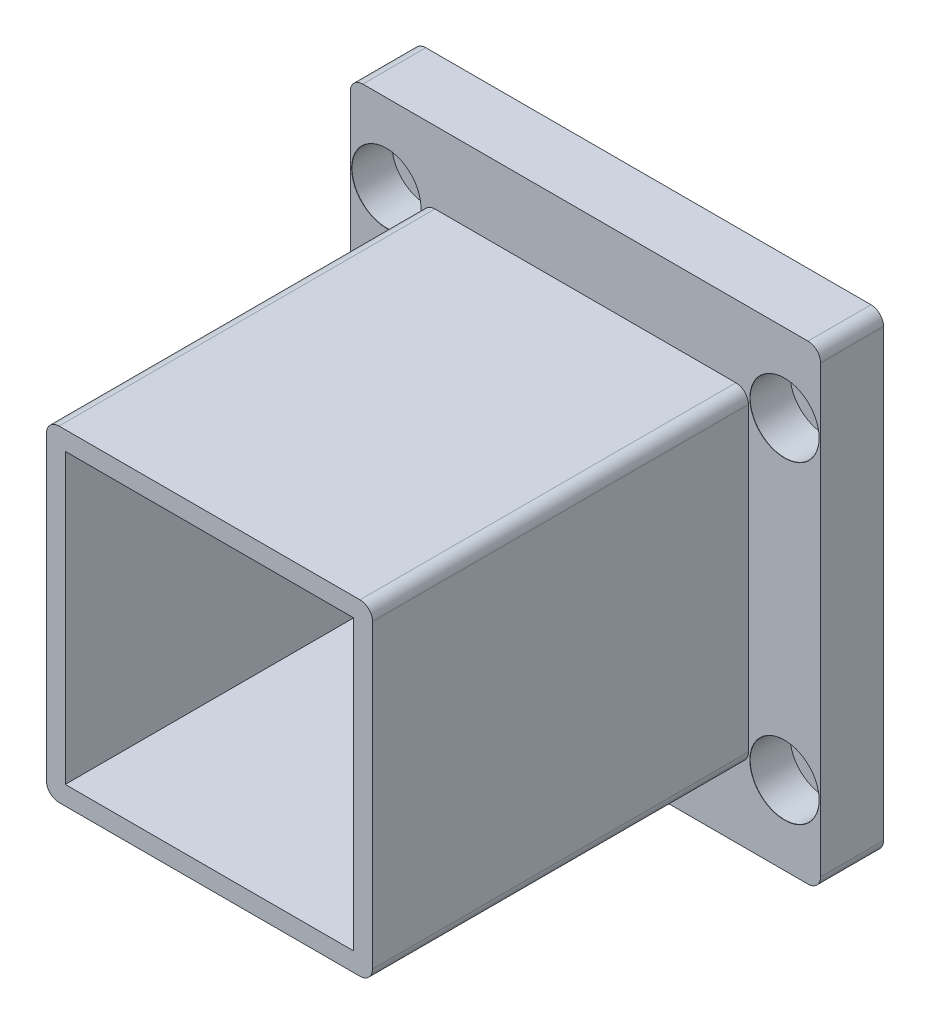
ISO-10303-21;
HEADER;
FILE_DESCRIPTION(('STEP AP214'),'2;1');
FILE_NAME('part.step','',(''),(''),'','','');
FILE_SCHEMA(('AUTOMOTIVE_DESIGN { 1 0 10303 214 1 1 1 1 }'));
ENDSEC;
DATA;
#1=APPLICATION_CONTEXT('core data for automotive mechanical design processes');
#2=APPLICATION_PROTOCOL_DEFINITION('international standard','automotive_design',2000,#1);
#3=PRODUCT_CONTEXT('',#1,'mechanical');
#4=PRODUCT('Part','Part','',(#3));
#5=PRODUCT_RELATED_PRODUCT_CATEGORY('part','',(#4));
#6=PRODUCT_DEFINITION_FORMATION('','',#4);
#7=PRODUCT_DEFINITION_CONTEXT('part definition',#1,'design');
#8=PRODUCT_DEFINITION('design','',#6,#7);
#9=PRODUCT_DEFINITION_SHAPE('','',#8);
#10=(LENGTH_UNIT() NAMED_UNIT(*) SI_UNIT(.MILLI.,.METRE.));
#11=(NAMED_UNIT(*) PLANE_ANGLE_UNIT() SI_UNIT($,.RADIAN.));
#12=(NAMED_UNIT(*) SI_UNIT($,.STERADIAN.) SOLID_ANGLE_UNIT());
#13=UNCERTAINTY_MEASURE_WITH_UNIT(LENGTH_MEASURE(1.E-05),#10,'distance_accuracy_value','');
#14=(GEOMETRIC_REPRESENTATION_CONTEXT(3) GLOBAL_UNCERTAINTY_ASSIGNED_CONTEXT((#13)) GLOBAL_UNIT_ASSIGNED_CONTEXT((#10,
#11,#12)) REPRESENTATION_CONTEXT('',''));
#15=CARTESIAN_POINT('',(0.,0.,0.));
#16=DIRECTION('',(0.,0.,1.));
#17=DIRECTION('',(1.,0.,0.));
#18=AXIS2_PLACEMENT_3D('',#15,#16,#17);
#19=CARTESIAN_POINT('',(0.,-26.0480038732877,65.));
#20=DIRECTION('',(0.,1.,0.));
#21=DIRECTION('',(-1.,0.,0.));
#22=AXIS2_PLACEMENT_3D('',#19,#20,#21);
#23=PLANE('',#22);
#24=DIRECTION('',(1.,0.,0.));
#25=VECTOR('',#24,1.);
#26=CARTESIAN_POINT('',(0.,-26.0480038732877,0.));
#27=LINE('',#26,#25);
#28=CARTESIAN_POINT('',(-27.1460943757474,-26.0480038732877,0.));
#29=VERTEX_POINT('',#28);
#30=CARTESIAN_POINT('',(18.8539056242526,-26.0480038732877,0.));
#31=VERTEX_POINT('',#30);
#32=EDGE_CURVE('E213',#29,#31,#27,.T.);
#33=ORIENTED_EDGE('',*,*,#32,.F.);
#34=DIRECTION('',(0.,0.,-1.));
#35=VECTOR('',#34,1.);
#36=CARTESIAN_POINT('',(-27.1460943757474,-26.0480038732877,65.));
#37=LINE('',#36,#35);
#38=CARTESIAN_POINT('',(-27.1460943757474,-26.0480038732877,65.));
#39=VERTEX_POINT('',#38);
#40=EDGE_CURVE('E223',#39,#29,#37,.T.);
#41=ORIENTED_EDGE('',*,*,#40,.F.);
#42=DIRECTION('',(1.,0.,0.));
#43=VECTOR('',#42,1.);
#44=CARTESIAN_POINT('',(0.,-26.0480038732877,65.));
#45=LINE('',#44,#43);
#46=CARTESIAN_POINT('',(18.8539056242526,-26.0480038732877,65.));
#47=VERTEX_POINT('',#46);
#48=EDGE_CURVE('E402',#39,#47,#45,.T.);
#49=ORIENTED_EDGE('',*,*,#48,.T.);
#50=DIRECTION('',(0.,0.,-1.));
#51=VECTOR('',#50,1.);
#52=CARTESIAN_POINT('',(18.8539056242526,-26.0480038732877,65.));
#53=LINE('',#52,#51);
#54=EDGE_CURVE('E234',#47,#31,#53,.T.);
#55=ORIENTED_EDGE('',*,*,#54,.T.);
#56=EDGE_LOOP('',(#33,#41,#49,#55));
#57=FACE_BOUND('',#56,.T.);
#58=ADVANCED_FACE('F71',(#57),#23,.T.);
#59=CARTESIAN_POINT('',(-27.1460943757474,0.,65.));
#60=DIRECTION('',(-1.,0.,0.));
#61=DIRECTION('',(0.,0.,1.));
#62=AXIS2_PLACEMENT_3D('',#59,#60,#61);
#63=PLANE('',#62);
#64=DIRECTION('',(0.,1.,0.));
#65=VECTOR('',#64,1.);
#66=CARTESIAN_POINT('',(-27.1460943757474,0.,0.));
#67=LINE('',#66,#65);
#68=CARTESIAN_POINT('',(-27.1460943757474,19.9519961267123,0.));
#69=VERTEX_POINT('',#68);
#70=EDGE_CURVE('E209',#29,#69,#67,.T.);
#71=ORIENTED_EDGE('',*,*,#70,.T.);
#72=DIRECTION('',(0.,0.,-1.));
#73=VECTOR('',#72,1.);
#74=CARTESIAN_POINT('',(-27.1460943757474,19.9519961267123,65.));
#75=LINE('',#74,#73);
#76=CARTESIAN_POINT('',(-27.1460943757474,19.9519961267123,65.));
#77=VERTEX_POINT('',#76);
#78=EDGE_CURVE('E232',#77,#69,#75,.T.);
#79=ORIENTED_EDGE('',*,*,#78,.F.);
#80=DIRECTION('',(0.,1.,0.));
#81=VECTOR('',#80,1.);
#82=CARTESIAN_POINT('',(-27.1460943757474,0.,65.));
#83=LINE('',#82,#81);
#84=EDGE_CURVE('E226',#39,#77,#83,.T.);
#85=ORIENTED_EDGE('',*,*,#84,.F.);
#86=ORIENTED_EDGE('',*,*,#40,.T.);
#87=EDGE_LOOP('',(#71,#79,#85,#86));
#88=FACE_BOUND('',#87,.T.);
#89=ADVANCED_FACE('F224',(#88),#63,.F.);
#90=CARTESIAN_POINT('',(0.,19.9519961267123,65.));
#91=DIRECTION('',(0.,1.,0.));
#92=DIRECTION('',(-1.,0.,0.));
#93=AXIS2_PLACEMENT_3D('',#90,#91,#92);
#94=PLANE('',#93);
#95=DIRECTION('',(1.,0.,0.));
#96=VECTOR('',#95,1.);
#97=CARTESIAN_POINT('',(0.,19.9519961267123,0.));
#98=LINE('',#97,#96);
#99=CARTESIAN_POINT('',(18.8539056242526,19.9519961267123,0.));
#100=VERTEX_POINT('',#99);
#101=EDGE_CURVE('E216',#69,#100,#98,.T.);
#102=ORIENTED_EDGE('',*,*,#101,.T.);
#103=DIRECTION('',(0.,0.,-1.));
#104=VECTOR('',#103,1.);
#105=CARTESIAN_POINT('',(18.8539056242526,19.9519961267123,65.));
#106=LINE('',#105,#104);
#107=CARTESIAN_POINT('',(18.8539056242526,19.9519961267123,65.));
#108=VERTEX_POINT('',#107);
#109=EDGE_CURVE('E255',#108,#100,#106,.T.);
#110=ORIENTED_EDGE('',*,*,#109,.F.);
#111=DIRECTION('',(1.,0.,0.));
#112=VECTOR('',#111,1.);
#113=CARTESIAN_POINT('',(0.,19.9519961267123,65.));
#114=LINE('',#113,#112);
#115=EDGE_CURVE('E406',#77,#108,#114,.T.);
#116=ORIENTED_EDGE('',*,*,#115,.F.);
#117=ORIENTED_EDGE('',*,*,#78,.T.);
#118=EDGE_LOOP('',(#102,#110,#116,#117));
#119=FACE_BOUND('',#118,.T.);
#120=ADVANCED_FACE('F415',(#119),#94,.F.);
#121=CARTESIAN_POINT('',(0.,22.9519961267123,65.));
#122=DIRECTION('',(0.,1.,0.));
#123=DIRECTION('',(-1.,0.,0.));
#124=AXIS2_PLACEMENT_3D('',#121,#122,#123);
#125=PLANE('',#124);
#126=DIRECTION('',(-1.,0.,0.));
#127=VECTOR('',#126,1.);
#128=CARTESIAN_POINT('',(-30.1460943757474,22.9519961267123,5.04707913219928));
#129=LINE('',#128,#127);
#130=CARTESIAN_POINT('',(19.8539056242526,22.9519961267123,5.04707913219928));
#131=VERTEX_POINT('',#130);
#132=CARTESIAN_POINT('',(-28.1460943757474,22.9519961267123,5.04707913219928));
#133=VERTEX_POINT('',#132);
#134=EDGE_CURVE('E362',#131,#133,#129,.T.);
#135=ORIENTED_EDGE('',*,*,#134,.T.);
#136=DIRECTION('',(0.,0.,-1.));
#137=VECTOR('',#136,1.);
#138=CARTESIAN_POINT('',(-28.1460943757474,22.9519961267123,65.));
#139=LINE('',#138,#137);
#140=CARTESIAN_POINT('',(-28.1460943757474,22.9519961267123,65.));
#141=VERTEX_POINT('',#140);
#142=EDGE_CURVE('E297',#133,#141,#139,.F.);
#143=ORIENTED_EDGE('',*,*,#142,.T.);
#144=DIRECTION('',(1.,0.,0.));
#145=VECTOR('',#144,1.);
#146=CARTESIAN_POINT('',(0.,22.9519961267123,65.));
#147=LINE('',#146,#145);
#148=CARTESIAN_POINT('',(19.8539056242526,22.9519961267123,65.));
#149=VERTEX_POINT('',#148);
#150=EDGE_CURVE('E252',#141,#149,#147,.T.);
#151=ORIENTED_EDGE('',*,*,#150,.T.);
#152=DIRECTION('',(0.,0.,-1.));
#153=VECTOR('',#152,1.);
#154=CARTESIAN_POINT('',(19.8539056242526,22.9519961267123,5.04707913219928));
#155=LINE('',#154,#153);
#156=EDGE_CURVE('E293',#149,#131,#155,.T.);
#157=ORIENTED_EDGE('',*,*,#156,.T.);
#158=EDGE_LOOP('',(#135,#143,#151,#157));
#159=FACE_BOUND('',#158,.T.);
#160=ADVANCED_FACE('F369',(#159),#125,.T.);
#161=CARTESIAN_POINT('',(-30.1460943757474,0.,65.));
#162=DIRECTION('',(-1.,0.,0.));
#163=DIRECTION('',(0.,0.,1.));
#164=AXIS2_PLACEMENT_3D('',#161,#162,#163);
#165=PLANE('',#164);
#166=DIRECTION('',(0.,-1.,0.));
#167=VECTOR('',#166,1.);
#168=CARTESIAN_POINT('',(-30.1460943757474,22.9519961267123,5.04707913219928));
#169=LINE('',#168,#167);
#170=CARTESIAN_POINT('',(-30.1460943757474,20.9519961267123,5.04707913219928));
#171=VERTEX_POINT('',#170);
#172=CARTESIAN_POINT('',(-30.1460943757474,-27.0480038732877,5.04707913219928));
#173=VERTEX_POINT('',#172);
#174=EDGE_CURVE('E364',#171,#173,#169,.T.);
#175=ORIENTED_EDGE('',*,*,#174,.T.);
#176=DIRECTION('',(0.,0.,-1.));
#177=VECTOR('',#176,1.);
#178=CARTESIAN_POINT('',(-30.1460943757474,-27.0480038732877,65.));
#179=LINE('',#178,#177);
#180=CARTESIAN_POINT('',(-30.1460943757474,-27.0480038732877,65.));
#181=VERTEX_POINT('',#180);
#182=EDGE_CURVE('E290',#173,#181,#179,.F.);
#183=ORIENTED_EDGE('',*,*,#182,.T.);
#184=DIRECTION('',(0.,1.,0.));
#185=VECTOR('',#184,1.);
#186=CARTESIAN_POINT('',(-30.1460943757474,0.,65.));
#187=LINE('',#186,#185);
#188=CARTESIAN_POINT('',(-30.1460943757474,20.9519961267123,65.));
#189=VERTEX_POINT('',#188);
#190=EDGE_CURVE('E385',#181,#189,#187,.T.);
#191=ORIENTED_EDGE('',*,*,#190,.T.);
#192=DIRECTION('',(0.,0.,-1.));
#193=VECTOR('',#192,1.);
#194=CARTESIAN_POINT('',(-30.1460943757474,20.9519961267123,65.));
#195=LINE('',#194,#193);
#196=EDGE_CURVE('E286',#189,#171,#195,.T.);
#197=ORIENTED_EDGE('',*,*,#196,.T.);
#198=EDGE_LOOP('',(#175,#183,#191,#197));
#199=FACE_BOUND('',#198,.T.);
#200=ADVANCED_FACE('F388',(#199),#165,.T.);
#201=CARTESIAN_POINT('',(0.,-29.0480038732877,65.));
#202=DIRECTION('',(0.,1.,0.));
#203=DIRECTION('',(-1.,0.,0.));
#204=AXIS2_PLACEMENT_3D('',#201,#202,#203);
#205=PLANE('',#204);
#206=DIRECTION('',(1.,0.,0.));
#207=VECTOR('',#206,1.);
#208=CARTESIAN_POINT('',(-30.1460943757474,-29.0480038732877,5.04707913219928));
#209=LINE('',#208,#207);
#210=CARTESIAN_POINT('',(-28.1460943757474,-29.0480038732877,5.04707913219928));
#211=VERTEX_POINT('',#210);
#212=CARTESIAN_POINT('',(19.8539056242526,-29.0480038732877,5.04707913219928));
#213=VERTEX_POINT('',#212);
#214=EDGE_CURVE('E835',#211,#213,#209,.T.);
#215=ORIENTED_EDGE('',*,*,#214,.T.);
#216=DIRECTION('',(0.,0.,-1.));
#217=VECTOR('',#216,1.);
#218=CARTESIAN_POINT('',(19.8539056242526,-29.0480038732877,65.));
#219=LINE('',#218,#217);
#220=CARTESIAN_POINT('',(19.8539056242526,-29.0480038732877,65.));
#221=VERTEX_POINT('',#220);
#222=EDGE_CURVE('E271',#213,#221,#219,.F.);
#223=ORIENTED_EDGE('',*,*,#222,.T.);
#224=DIRECTION('',(1.,0.,0.));
#225=VECTOR('',#224,1.);
#226=CARTESIAN_POINT('',(0.,-29.0480038732877,65.));
#227=LINE('',#226,#225);
#228=CARTESIAN_POINT('',(-28.1460943757474,-29.0480038732877,65.));
#229=VERTEX_POINT('',#228);
#230=EDGE_CURVE('E391',#229,#221,#227,.T.);
#231=ORIENTED_EDGE('',*,*,#230,.F.);
#232=DIRECTION('',(0.,0.,-1.));
#233=VECTOR('',#232,1.);
#234=CARTESIAN_POINT('',(-28.1460943757474,-29.0480038732877,5.04707913219928));
#235=LINE('',#234,#233);
#236=EDGE_CURVE('E267',#229,#211,#235,.T.);
#237=ORIENTED_EDGE('',*,*,#236,.T.);
#238=EDGE_LOOP('',(#215,#223,#231,#237));
#239=FACE_BOUND('',#238,.T.);
#240=ADVANCED_FACE('F434',(#239),#205,.F.);
#241=CARTESIAN_POINT('',(21.8539056242526,0.,65.));
#242=DIRECTION('',(-1.,0.,0.));
#243=DIRECTION('',(0.,0.,1.));
#244=AXIS2_PLACEMENT_3D('',#241,#242,#243);
#245=PLANE('',#244);
#246=DIRECTION('',(0.,1.,0.));
#247=VECTOR('',#246,1.);
#248=CARTESIAN_POINT('',(21.8539056242526,0.,65.));
#249=LINE('',#248,#247);
#250=CARTESIAN_POINT('',(21.8539056242526,-27.0480038732877,65.));
#251=VERTEX_POINT('',#250);
#252=CARTESIAN_POINT('',(21.8539056242526,20.9519961267123,65.));
#253=VERTEX_POINT('',#252);
#254=EDGE_CURVE('E395',#251,#253,#249,.T.);
#255=ORIENTED_EDGE('',*,*,#254,.F.);
#256=DIRECTION('',(0.,0.,-1.));
#257=VECTOR('',#256,1.);
#258=CARTESIAN_POINT('',(21.8539056242526,-27.0480038732877,65.));
#259=LINE('',#258,#257);
#260=CARTESIAN_POINT('',(21.8539056242526,-27.0480038732877,5.04707913219928));
#261=VERTEX_POINT('',#260);
#262=EDGE_CURVE('E263',#251,#261,#259,.T.);
#263=ORIENTED_EDGE('',*,*,#262,.T.);
#264=DIRECTION('',(0.,1.,0.));
#265=VECTOR('',#264,1.);
#266=CARTESIAN_POINT('',(21.8539056242526,22.9519961267123,5.04707913219928));
#267=LINE('',#266,#265);
#268=CARTESIAN_POINT('',(21.8539056242526,20.9519961267123,5.04707913219928));
#269=VERTEX_POINT('',#268);
#270=EDGE_CURVE('E375',#261,#269,#267,.T.);
#271=ORIENTED_EDGE('',*,*,#270,.T.);
#272=DIRECTION('',(0.,0.,-1.));
#273=VECTOR('',#272,1.);
#274=CARTESIAN_POINT('',(21.8539056242526,20.9519961267123,65.));
#275=LINE('',#274,#273);
#276=EDGE_CURVE('E231',#269,#253,#275,.F.);
#277=ORIENTED_EDGE('',*,*,#276,.T.);
#278=EDGE_LOOP('',(#255,#263,#271,#277));
#279=FACE_BOUND('',#278,.T.);
#280=ADVANCED_FACE('F431',(#279),#245,.F.);
#281=CARTESIAN_POINT('',(18.8539056242526,0.,65.));
#282=DIRECTION('',(-1.,0.,0.));
#283=DIRECTION('',(0.,0.,1.));
#284=AXIS2_PLACEMENT_3D('',#281,#282,#283);
#285=PLANE('',#284);
#286=DIRECTION('',(0.,1.,0.));
#287=VECTOR('',#286,1.);
#288=CARTESIAN_POINT('',(18.8539056242526,0.,0.));
#289=LINE('',#288,#287);
#290=EDGE_CURVE('E249',#31,#100,#289,.T.);
#291=ORIENTED_EDGE('',*,*,#290,.F.);
#292=ORIENTED_EDGE('',*,*,#54,.F.);
#293=DIRECTION('',(0.,1.,0.));
#294=VECTOR('',#293,1.);
#295=CARTESIAN_POINT('',(18.8539056242526,0.,65.));
#296=LINE('',#295,#294);
#297=EDGE_CURVE('E244',#47,#108,#296,.T.);
#298=ORIENTED_EDGE('',*,*,#297,.T.);
#299=ORIENTED_EDGE('',*,*,#109,.T.);
#300=EDGE_LOOP('',(#291,#292,#298,#299));
#301=FACE_BOUND('',#300,.T.);
#302=ADVANCED_FACE('F413',(#301),#285,.T.);
#303=CARTESIAN_POINT('',(0.,0.,65.));
#304=DIRECTION('',(0.,0.,1.));
#305=DIRECTION('',(1.,0.,0.));
#306=AXIS2_PLACEMENT_3D('',#303,#304,#305);
#307=PLANE('',#306);
#308=ORIENTED_EDGE('',*,*,#230,.T.);
#309=CARTESIAN_POINT('',(19.8539056242526,-27.0480038732877,65.));
#310=DIRECTION('',(0.,0.,1.));
#311=DIRECTION('',(1.,0.,0.));
#312=AXIS2_PLACEMENT_3D('',#309,#310,#311);
#313=CIRCLE('',#312,2.);
#314=EDGE_CURVE('E283',#221,#251,#313,.T.);
#315=ORIENTED_EDGE('',*,*,#314,.T.);
#316=ORIENTED_EDGE('',*,*,#254,.T.);
#317=CARTESIAN_POINT('',(19.8539056242526,20.9519961267123,65.));
#318=DIRECTION('',(0.,0.,1.));
#319=DIRECTION('',(1.,0.,0.));
#320=AXIS2_PLACEMENT_3D('',#317,#318,#319);
#321=CIRCLE('',#320,2.);
#322=EDGE_CURVE('E274',#253,#149,#321,.T.);
#323=ORIENTED_EDGE('',*,*,#322,.T.);
#324=ORIENTED_EDGE('',*,*,#150,.F.);
#325=CARTESIAN_POINT('',(-28.1460943757474,20.9519961267123,65.));
#326=DIRECTION('',(0.,0.,1.));
#327=DIRECTION('',(1.,0.,0.));
#328=AXIS2_PLACEMENT_3D('',#325,#326,#327);
#329=CIRCLE('',#328,2.);
#330=EDGE_CURVE('E277',#141,#189,#329,.T.);
#331=ORIENTED_EDGE('',*,*,#330,.T.);
#332=ORIENTED_EDGE('',*,*,#190,.F.);
#333=CARTESIAN_POINT('',(-28.1460943757474,-27.0480038732877,65.));
#334=DIRECTION('',(0.,0.,1.));
#335=DIRECTION('',(1.,0.,0.));
#336=AXIS2_PLACEMENT_3D('',#333,#334,#335);
#337=CIRCLE('',#336,2.);
#338=EDGE_CURVE('E280',#181,#229,#337,.T.);
#339=ORIENTED_EDGE('',*,*,#338,.T.);
#340=EDGE_LOOP('',(#308,#315,#316,#323,#324,#331,#332,#339));
#341=FACE_BOUND('',#340,.T.);
#342=ORIENTED_EDGE('',*,*,#48,.F.);
#343=ORIENTED_EDGE('',*,*,#84,.T.);
#344=ORIENTED_EDGE('',*,*,#115,.T.);
#345=ORIENTED_EDGE('',*,*,#297,.F.);
#346=EDGE_LOOP('',(#342,#343,#344,#345));
#347=FACE_BOUND('',#346,.T.);
#348=ADVANCED_FACE('F383',(#341,#347),#307,.T.);
#349=CARTESIAN_POINT('',(0.,0.,0.));
#350=DIRECTION('',(0.,0.,-1.));
#351=DIRECTION('',(-1.,0.,0.));
#352=AXIS2_PLACEMENT_3D('',#349,#350,#351);
#353=PLANE('',#352);
#354=ORIENTED_EDGE('',*,*,#70,.F.);
#355=ORIENTED_EDGE('',*,*,#32,.T.);
#356=ORIENTED_EDGE('',*,*,#290,.T.);
#357=ORIENTED_EDGE('',*,*,#101,.F.);
#358=EDGE_LOOP('',(#354,#355,#356,#357));
#359=FACE_BOUND('',#358,.T.);
#360=ADVANCED_FACE('F211',(#359),#353,.F.);
#361=CARTESIAN_POINT('',(0.,0.,5.04707913219928));
#362=DIRECTION('',(0.,0.,1.));
#363=DIRECTION('',(1.,0.,0.));
#364=AXIS2_PLACEMENT_3D('',#361,#362,#363);
#365=PLANE('',#364);
#366=CARTESIAN_POINT('',(-35.8960943757474,21.9519961267123,5.04707913219928));
#367=DIRECTION('',(0.,0.,1.));
#368=DIRECTION('',(1.,0.,0.));
#369=AXIS2_PLACEMENT_3D('',#366,#367,#368);
#370=CIRCLE('',#369,5.525);
#371=CARTESIAN_POINT('',(-30.3710943757474,21.9519961267123,5.04707913219928));
#372=VERTEX_POINT('',#371);
#373=EDGE_CURVE('E916',#372,#372,#370,.T.);
#374=ORIENTED_EDGE('',*,*,#373,.F.);
#375=EDGE_LOOP('',(#374));
#376=FACE_BOUND('',#375,.T.);
#377=CARTESIAN_POINT('',(-35.8960943757474,-28.0480038732877,5.04707913219928));
#378=DIRECTION('',(0.,0.,1.));
#379=DIRECTION('',(1.,0.,0.));
#380=AXIS2_PLACEMENT_3D('',#377,#378,#379);
#381=CIRCLE('',#380,5.525);
#382=CARTESIAN_POINT('',(-30.3710943757474,-28.0480038732877,5.04707913219928));
#383=VERTEX_POINT('',#382);
#384=EDGE_CURVE('E898',#383,#383,#381,.T.);
#385=ORIENTED_EDGE('',*,*,#384,.F.);
#386=EDGE_LOOP('',(#385));
#387=FACE_BOUND('',#386,.T.);
#388=CARTESIAN_POINT('',(27.6039056242526,21.9519961267123,5.04707913219928));
#389=DIRECTION('',(0.,0.,1.));
#390=DIRECTION('',(1.,0.,0.));
#391=AXIS2_PLACEMENT_3D('',#388,#389,#390);
#392=CIRCLE('',#391,5.52500000000001);
#393=CARTESIAN_POINT('',(33.1289056242526,21.9519961267123,5.04707913219928));
#394=VERTEX_POINT('',#393);
#395=EDGE_CURVE('E880',#394,#394,#392,.T.);
#396=ORIENTED_EDGE('',*,*,#395,.F.);
#397=EDGE_LOOP('',(#396));
#398=FACE_BOUND('',#397,.T.);
#399=CARTESIAN_POINT('',(27.6039056242526,-28.0480038732877,5.04707913219928));
#400=DIRECTION('',(0.,0.,1.));
#401=DIRECTION('',(1.,0.,0.));
#402=AXIS2_PLACEMENT_3D('',#399,#400,#401);
#403=CIRCLE('',#402,5.525);
#404=CARTESIAN_POINT('',(33.1289056242526,-28.0480038732877,5.04707913219928));
#405=VERTEX_POINT('',#404);
#406=EDGE_CURVE('E862',#405,#405,#403,.T.);
#407=ORIENTED_EDGE('',*,*,#406,.F.);
#408=EDGE_LOOP('',(#407));
#409=FACE_BOUND('',#408,.T.);
#410=DIRECTION('',(0.,1.,0.));
#411=VECTOR('',#410,1.);
#412=CARTESIAN_POINT('',(33.3539056242526,34.4519961267123,5.04707913219928));
#413=LINE('',#412,#411);
#414=CARTESIAN_POINT('',(33.3539056242526,-38.5480038732877,5.04707913219928));
#415=VERTEX_POINT('',#414);
#416=CARTESIAN_POINT('',(33.3539056242526,32.4519961267123,5.04707913219928));
#417=VERTEX_POINT('',#416);
#418=EDGE_CURVE('E483',#415,#417,#413,.T.);
#419=ORIENTED_EDGE('',*,*,#418,.T.);
#420=CARTESIAN_POINT('',(31.3539056242526,32.4519961267123,5.04707913219928));
#421=DIRECTION('',(0.,0.,1.));
#422=DIRECTION('',(1.,0.,0.));
#423=AXIS2_PLACEMENT_3D('',#420,#421,#422);
#424=CIRCLE('',#423,2.);
#425=CARTESIAN_POINT('',(31.3539056242526,34.4519961267123,5.04707913219928));
#426=VERTEX_POINT('',#425);
#427=EDGE_CURVE('E316',#417,#426,#424,.T.);
#428=ORIENTED_EDGE('',*,*,#427,.T.);
#429=DIRECTION('',(-1.,0.,0.));
#430=VECTOR('',#429,1.);
#431=CARTESIAN_POINT('',(-41.6460943757474,34.4519961267123,5.04707913219928));
#432=LINE('',#431,#430);
#433=CARTESIAN_POINT('',(-39.6460943757474,34.4519961267123,5.04707913219928));
#434=VERTEX_POINT('',#433);
#435=EDGE_CURVE('E489',#426,#434,#432,.T.);
#436=ORIENTED_EDGE('',*,*,#435,.T.);
#437=CARTESIAN_POINT('',(-39.6460943757474,32.4519961267123,5.04707913219928));
#438=DIRECTION('',(0.,0.,1.));
#439=DIRECTION('',(1.,0.,0.));
#440=AXIS2_PLACEMENT_3D('',#437,#438,#439);
#441=CIRCLE('',#440,2.);
#442=CARTESIAN_POINT('',(-41.6460943757474,32.4519961267123,5.04707913219928));
#443=VERTEX_POINT('',#442);
#444=EDGE_CURVE('E313',#434,#443,#441,.T.);
#445=ORIENTED_EDGE('',*,*,#444,.T.);
#446=DIRECTION('',(0.,-1.,0.));
#447=VECTOR('',#446,1.);
#448=CARTESIAN_POINT('',(-41.6460943757474,34.4519961267123,5.04707913219928));
#449=LINE('',#448,#447);
#450=CARTESIAN_POINT('',(-41.6460943757473,-38.5480038732877,5.04707913219928));
#451=VERTEX_POINT('',#450);
#452=EDGE_CURVE('E374',#443,#451,#449,.T.);
#453=ORIENTED_EDGE('',*,*,#452,.T.);
#454=CARTESIAN_POINT('',(-39.6460943757474,-38.5480038732877,5.04707913219928));
#455=DIRECTION('',(0.,0.,1.));
#456=DIRECTION('',(1.,0.,0.));
#457=AXIS2_PLACEMENT_3D('',#454,#455,#456);
#458=CIRCLE('',#457,2.);
#459=CARTESIAN_POINT('',(-39.6460943757474,-40.5480038732877,5.04707913219928));
#460=VERTEX_POINT('',#459);
#461=EDGE_CURVE('E310',#451,#460,#458,.T.);
#462=ORIENTED_EDGE('',*,*,#461,.T.);
#463=DIRECTION('',(1.,0.,0.));
#464=VECTOR('',#463,1.);
#465=CARTESIAN_POINT('',(-41.6460943757473,-40.5480038732877,5.04707913219928));
#466=LINE('',#465,#464);
#467=CARTESIAN_POINT('',(31.3539056242526,-40.5480038732877,5.04707913219928));
#468=VERTEX_POINT('',#467);
#469=EDGE_CURVE('E480',#460,#468,#466,.T.);
#470=ORIENTED_EDGE('',*,*,#469,.T.);
#471=CARTESIAN_POINT('',(31.3539056242526,-38.5480038732877,5.04707913219928));
#472=DIRECTION('',(0.,0.,1.));
#473=DIRECTION('',(1.,0.,0.));
#474=AXIS2_PLACEMENT_3D('',#471,#472,#473);
#475=CIRCLE('',#474,2.);
#476=EDGE_CURVE('E307',#468,#415,#475,.T.);
#477=ORIENTED_EDGE('',*,*,#476,.T.);
#478=EDGE_LOOP('',(#419,#428,#436,#445,#453,#462,#470,#477));
#479=FACE_BOUND('',#478,.T.);
#480=ORIENTED_EDGE('',*,*,#214,.F.);
#481=CARTESIAN_POINT('',(-28.1460943757474,-27.0480038732877,5.04707913219928));
#482=DIRECTION('',(0.,0.,1.));
#483=DIRECTION('',(1.,0.,0.));
#484=AXIS2_PLACEMENT_3D('',#481,#482,#483);
#485=CIRCLE('',#484,2.);
#486=EDGE_CURVE('E353',#211,#173,#485,.F.);
#487=ORIENTED_EDGE('',*,*,#486,.T.);
#488=ORIENTED_EDGE('',*,*,#174,.F.);
#489=CARTESIAN_POINT('',(-28.1460943757474,20.9519961267123,5.04707913219928));
#490=DIRECTION('',(0.,0.,1.));
#491=DIRECTION('',(1.,0.,0.));
#492=AXIS2_PLACEMENT_3D('',#489,#490,#491);
#493=CIRCLE('',#492,2.);
#494=EDGE_CURVE('E80',#171,#133,#493,.F.);
#495=ORIENTED_EDGE('',*,*,#494,.T.);
#496=ORIENTED_EDGE('',*,*,#134,.F.);
#497=CARTESIAN_POINT('',(19.8539056242526,20.9519961267123,5.04707913219928));
#498=DIRECTION('',(0.,0.,1.));
#499=DIRECTION('',(1.,0.,0.));
#500=AXIS2_PLACEMENT_3D('',#497,#498,#499);
#501=CIRCLE('',#500,2.);
#502=EDGE_CURVE('E12',#131,#269,#501,.F.);
#503=ORIENTED_EDGE('',*,*,#502,.T.);
#504=ORIENTED_EDGE('',*,*,#270,.F.);
#505=CARTESIAN_POINT('',(19.8539056242526,-27.0480038732877,5.04707913219928));
#506=DIRECTION('',(0.,0.,1.));
#507=DIRECTION('',(1.,0.,0.));
#508=AXIS2_PLACEMENT_3D('',#505,#506,#507);
#509=CIRCLE('',#508,2.);
#510=EDGE_CURVE('E350',#261,#213,#509,.F.);
#511=ORIENTED_EDGE('',*,*,#510,.T.);
#512=EDGE_LOOP('',(#480,#487,#488,#495,#496,#503,#504,#511));
#513=FACE_BOUND('',#512,.T.);
#514=ADVANCED_FACE('F361',(#376,#387,#398,#409,#479,#513),#365,.T.);
#515=CARTESIAN_POINT('',(0.,0.,-5.));
#516=DIRECTION('',(0.,0.,-1.));
#517=DIRECTION('',(-1.,0.,0.));
#518=AXIS2_PLACEMENT_3D('',#515,#516,#517);
#519=PLANE('',#518);
#520=CARTESIAN_POINT('',(-35.8960943757474,21.9519961267123,-5.));
#521=DIRECTION('',(0.,0.,1.));
#522=DIRECTION('',(1.,0.,0.));
#523=AXIS2_PLACEMENT_3D('',#520,#521,#522);
#524=CIRCLE('',#523,3.3);
#525=CARTESIAN_POINT('',(-32.5960943757474,21.9519961267123,-5.));
#526=VERTEX_POINT('',#525);
#527=EDGE_CURVE('E818',#526,#526,#524,.T.);
#528=ORIENTED_EDGE('',*,*,#527,.T.);
#529=EDGE_LOOP('',(#528));
#530=FACE_BOUND('',#529,.T.);
#531=CARTESIAN_POINT('',(-35.8960943757474,-28.0480038732877,-5.));
#532=DIRECTION('',(0.,0.,1.));
#533=DIRECTION('',(1.,0.,0.));
#534=AXIS2_PLACEMENT_3D('',#531,#532,#533);
#535=CIRCLE('',#534,3.3);
#536=CARTESIAN_POINT('',(-32.5960943757474,-28.0480038732877,-5.));
#537=VERTEX_POINT('',#536);
#538=EDGE_CURVE('E822',#537,#537,#535,.T.);
#539=ORIENTED_EDGE('',*,*,#538,.T.);
#540=EDGE_LOOP('',(#539));
#541=FACE_BOUND('',#540,.T.);
#542=CARTESIAN_POINT('',(27.6039056242526,21.9519961267123,-5.));
#543=DIRECTION('',(0.,0.,1.));
#544=DIRECTION('',(1.,0.,0.));
#545=AXIS2_PLACEMENT_3D('',#542,#543,#544);
#546=CIRCLE('',#545,3.3);
#547=CARTESIAN_POINT('',(30.9039056242526,21.9519961267123,-5.));
#548=VERTEX_POINT('',#547);
#549=EDGE_CURVE('E826',#548,#548,#546,.T.);
#550=ORIENTED_EDGE('',*,*,#549,.T.);
#551=EDGE_LOOP('',(#550));
#552=FACE_BOUND('',#551,.T.);
#553=CARTESIAN_POINT('',(27.6039056242526,-28.0480038732877,-5.));
#554=DIRECTION('',(0.,0.,1.));
#555=DIRECTION('',(1.,0.,0.));
#556=AXIS2_PLACEMENT_3D('',#553,#554,#555);
#557=CIRCLE('',#556,3.3);
#558=CARTESIAN_POINT('',(30.9039056242526,-28.0480038732877,-5.));
#559=VERTEX_POINT('',#558);
#560=EDGE_CURVE('E829',#559,#559,#557,.T.);
#561=ORIENTED_EDGE('',*,*,#560,.T.);
#562=EDGE_LOOP('',(#561));
#563=FACE_BOUND('',#562,.T.);
#564=DIRECTION('',(1.,0.,0.));
#565=VECTOR('',#564,1.);
#566=CARTESIAN_POINT('',(0.,34.4519961267123,-5.));
#567=LINE('',#566,#565);
#568=CARTESIAN_POINT('',(-39.6460943757474,34.4519961267123,-5.));
#569=VERTEX_POINT('',#568);
#570=CARTESIAN_POINT('',(31.3539056242526,34.4519961267123,-5.));
#571=VERTEX_POINT('',#570);
#572=EDGE_CURVE('E237',#569,#571,#567,.T.);
#573=ORIENTED_EDGE('',*,*,#572,.T.);
#574=CARTESIAN_POINT('',(31.3539056242526,32.4519961267123,-5.));
#575=DIRECTION('',(0.,0.,-1.));
#576=DIRECTION('',(-1.,0.,0.));
#577=AXIS2_PLACEMENT_3D('',#574,#575,#576);
#578=CIRCLE('',#577,2.);
#579=CARTESIAN_POINT('',(33.3539056242526,32.4519961267123,-5.));
#580=VERTEX_POINT('',#579);
#581=EDGE_CURVE('E334',#571,#580,#578,.T.);
#582=ORIENTED_EDGE('',*,*,#581,.T.);
#583=DIRECTION('',(0.,1.,0.));
#584=VECTOR('',#583,1.);
#585=CARTESIAN_POINT('',(33.3539056242526,0.,-5.));
#586=LINE('',#585,#584);
#587=CARTESIAN_POINT('',(33.3539056242526,-38.5480038732877,-5.));
#588=VERTEX_POINT('',#587);
#589=EDGE_CURVE('E492',#588,#580,#586,.T.);
#590=ORIENTED_EDGE('',*,*,#589,.F.);
#591=CARTESIAN_POINT('',(31.3539056242526,-38.5480038732877,-5.));
#592=DIRECTION('',(0.,0.,-1.));
#593=DIRECTION('',(-1.,0.,0.));
#594=AXIS2_PLACEMENT_3D('',#591,#592,#593);
#595=CIRCLE('',#594,2.);
#596=CARTESIAN_POINT('',(31.3539056242526,-40.5480038732877,-5.));
#597=VERTEX_POINT('',#596);
#598=EDGE_CURVE('E326',#588,#597,#595,.T.);
#599=ORIENTED_EDGE('',*,*,#598,.T.);
#600=DIRECTION('',(1.,0.,0.));
#601=VECTOR('',#600,1.);
#602=CARTESIAN_POINT('',(0.,-40.5480038732877,-5.));
#603=LINE('',#602,#601);
#604=CARTESIAN_POINT('',(-39.6460943757474,-40.5480038732877,-5.));
#605=VERTEX_POINT('',#604);
#606=EDGE_CURVE('E496',#605,#597,#603,.T.);
#607=ORIENTED_EDGE('',*,*,#606,.F.);
#608=CARTESIAN_POINT('',(-39.6460943757474,-38.5480038732877,-5.));
#609=DIRECTION('',(0.,0.,-1.));
#610=DIRECTION('',(-1.,0.,0.));
#611=AXIS2_PLACEMENT_3D('',#608,#609,#610);
#612=CIRCLE('',#611,2.);
#613=CARTESIAN_POINT('',(-41.6460943757474,-38.5480038732877,-5.));
#614=VERTEX_POINT('',#613);
#615=EDGE_CURVE('E94',#605,#614,#612,.T.);
#616=ORIENTED_EDGE('',*,*,#615,.T.);
#617=DIRECTION('',(0.,1.,0.));
#618=VECTOR('',#617,1.);
#619=CARTESIAN_POINT('',(-41.6460943757474,0.,-5.));
#620=LINE('',#619,#618);
#621=CARTESIAN_POINT('',(-41.6460943757474,32.4519961267123,-5.));
#622=VERTEX_POINT('',#621);
#623=EDGE_CURVE('E241',#614,#622,#620,.T.);
#624=ORIENTED_EDGE('',*,*,#623,.T.);
#625=CARTESIAN_POINT('',(-39.6460943757474,32.4519961267123,-5.));
#626=DIRECTION('',(0.,0.,-1.));
#627=DIRECTION('',(-1.,0.,0.));
#628=AXIS2_PLACEMENT_3D('',#625,#626,#627);
#629=CIRCLE('',#628,2.);
#630=EDGE_CURVE('E331',#622,#569,#629,.T.);
#631=ORIENTED_EDGE('',*,*,#630,.T.);
#632=EDGE_LOOP('',(#573,#582,#590,#599,#607,#616,#624,#631));
#633=FACE_BOUND('',#632,.T.);
#634=ADVANCED_FACE('F502',(#530,#541,#552,#563,#633),#519,.T.);
#635=CARTESIAN_POINT('',(0.,34.4519961267123,-5.));
#636=DIRECTION('',(0.,-1.,0.));
#637=DIRECTION('',(0.,0.,-1.));
#638=AXIS2_PLACEMENT_3D('',#635,#636,#637);
#639=PLANE('',#638);
#640=ORIENTED_EDGE('',*,*,#435,.F.);
#641=DIRECTION('',(0.,0.,1.));
#642=VECTOR('',#641,1.);
#643=CARTESIAN_POINT('',(31.3539056242526,34.4519961267123,-5.));
#644=LINE('',#643,#642);
#645=EDGE_CURVE('E323',#426,#571,#644,.F.);
#646=ORIENTED_EDGE('',*,*,#645,.T.);
#647=ORIENTED_EDGE('',*,*,#572,.F.);
#648=DIRECTION('',(0.,0.,1.));
#649=VECTOR('',#648,1.);
#650=CARTESIAN_POINT('',(-39.6460943757474,34.4519961267123,-5.));
#651=LINE('',#650,#649);
#652=EDGE_CURVE('E319',#569,#434,#651,.T.);
#653=ORIENTED_EDGE('',*,*,#652,.T.);
#654=EDGE_LOOP('',(#640,#646,#647,#653));
#655=FACE_BOUND('',#654,.T.);
#656=ADVANCED_FACE('F507',(#655),#639,.F.);
#657=CARTESIAN_POINT('',(33.3539056242526,0.,-5.));
#658=DIRECTION('',(1.,0.,0.));
#659=DIRECTION('',(0.,1.,0.));
#660=AXIS2_PLACEMENT_3D('',#657,#658,#659);
#661=PLANE('',#660);
#662=ORIENTED_EDGE('',*,*,#589,.T.);
#663=DIRECTION('',(0.,0.,1.));
#664=VECTOR('',#663,1.);
#665=CARTESIAN_POINT('',(33.3539056242526,32.4519961267123,5.04707913219928));
#666=LINE('',#665,#664);
#667=EDGE_CURVE('E303',#580,#417,#666,.T.);
#668=ORIENTED_EDGE('',*,*,#667,.T.);
#669=ORIENTED_EDGE('',*,*,#418,.F.);
#670=DIRECTION('',(0.,0.,1.));
#671=VECTOR('',#670,1.);
#672=CARTESIAN_POINT('',(33.3539056242526,-38.5480038732877,-5.));
#673=LINE('',#672,#671);
#674=EDGE_CURVE('E300',#415,#588,#673,.F.);
#675=ORIENTED_EDGE('',*,*,#674,.T.);
#676=EDGE_LOOP('',(#662,#668,#669,#675));
#677=FACE_BOUND('',#676,.T.);
#678=ADVANCED_FACE('F513',(#677),#661,.T.);
#679=CARTESIAN_POINT('',(0.,-40.5480038732877,-5.));
#680=DIRECTION('',(0.,-1.,0.));
#681=DIRECTION('',(0.,0.,-1.));
#682=AXIS2_PLACEMENT_3D('',#679,#680,#681);
#683=PLANE('',#682);
#684=ORIENTED_EDGE('',*,*,#469,.F.);
#685=DIRECTION('',(0.,0.,1.));
#686=VECTOR('',#685,1.);
#687=CARTESIAN_POINT('',(-39.6460943757474,-40.5480038732877,-5.));
#688=LINE('',#687,#686);
#689=EDGE_CURVE('E347',#460,#605,#688,.F.);
#690=ORIENTED_EDGE('',*,*,#689,.T.);
#691=ORIENTED_EDGE('',*,*,#606,.T.);
#692=DIRECTION('',(0.,0.,1.));
#693=VECTOR('',#692,1.);
#694=CARTESIAN_POINT('',(31.3539056242526,-40.5480038732877,-5.));
#695=LINE('',#694,#693);
#696=EDGE_CURVE('E343',#597,#468,#695,.T.);
#697=ORIENTED_EDGE('',*,*,#696,.T.);
#698=EDGE_LOOP('',(#684,#690,#691,#697));
#699=FACE_BOUND('',#698,.T.);
#700=ADVANCED_FACE('F519',(#699),#683,.T.);
#701=CARTESIAN_POINT('',(-41.6460943757474,0.,-5.));
#702=DIRECTION('',(1.,0.,0.));
#703=DIRECTION('',(0.,1.,0.));
#704=AXIS2_PLACEMENT_3D('',#701,#702,#703);
#705=PLANE('',#704);
#706=ORIENTED_EDGE('',*,*,#452,.F.);
#707=DIRECTION('',(0.,0.,1.));
#708=VECTOR('',#707,1.);
#709=CARTESIAN_POINT('',(-41.6460943757474,32.4519961267123,-5.));
#710=LINE('',#709,#708);
#711=EDGE_CURVE('E87',#443,#622,#710,.F.);
#712=ORIENTED_EDGE('',*,*,#711,.T.);
#713=ORIENTED_EDGE('',*,*,#623,.F.);
#714=DIRECTION('',(0.,0.,1.));
#715=VECTOR('',#714,1.);
#716=CARTESIAN_POINT('',(-41.6460943757474,-38.5480038732877,5.04707913219928));
#717=LINE('',#716,#715);
#718=EDGE_CURVE('E337',#614,#451,#717,.T.);
#719=ORIENTED_EDGE('',*,*,#718,.T.);
#720=EDGE_LOOP('',(#706,#712,#713,#719));
#721=FACE_BOUND('',#720,.T.);
#722=ADVANCED_FACE('F445',(#721),#705,.F.);
#723=CARTESIAN_POINT('',(19.8539056242526,-27.0480038732877,65.));
#724=DIRECTION('',(0.,0.,-1.));
#725=DIRECTION('',(-1.,0.,0.));
#726=AXIS2_PLACEMENT_3D('',#723,#724,#725);
#727=CYLINDRICAL_SURFACE('',#726,2.);
#728=ORIENTED_EDGE('',*,*,#314,.F.);
#729=ORIENTED_EDGE('',*,*,#222,.F.);
#730=ORIENTED_EDGE('',*,*,#510,.F.);
#731=ORIENTED_EDGE('',*,*,#262,.F.);
#732=EDGE_LOOP('',(#728,#729,#730,#731));
#733=FACE_BOUND('',#732,.T.);
#734=ADVANCED_FACE('F441',(#733),#727,.T.);
#735=CARTESIAN_POINT('',(-28.1460943757474,-27.0480038732877,65.));
#736=DIRECTION('',(0.,0.,1.));
#737=DIRECTION('',(1.,0.,0.));
#738=AXIS2_PLACEMENT_3D('',#735,#736,#737);
#739=CYLINDRICAL_SURFACE('',#738,2.);
#740=ORIENTED_EDGE('',*,*,#338,.F.);
#741=ORIENTED_EDGE('',*,*,#182,.F.);
#742=ORIENTED_EDGE('',*,*,#486,.F.);
#743=ORIENTED_EDGE('',*,*,#236,.F.);
#744=EDGE_LOOP('',(#740,#741,#742,#743));
#745=FACE_BOUND('',#744,.T.);
#746=ADVANCED_FACE('F444',(#745),#739,.T.);
#747=CARTESIAN_POINT('',(-28.1460943757474,20.9519961267123,65.));
#748=DIRECTION('',(0.,0.,-1.));
#749=DIRECTION('',(-1.,0.,0.));
#750=AXIS2_PLACEMENT_3D('',#747,#748,#749);
#751=CYLINDRICAL_SURFACE('',#750,2.);
#752=ORIENTED_EDGE('',*,*,#330,.F.);
#753=ORIENTED_EDGE('',*,*,#142,.F.);
#754=ORIENTED_EDGE('',*,*,#494,.F.);
#755=ORIENTED_EDGE('',*,*,#196,.F.);
#756=EDGE_LOOP('',(#752,#753,#754,#755));
#757=FACE_BOUND('',#756,.T.);
#758=ADVANCED_FACE('F378',(#757),#751,.T.);
#759=CARTESIAN_POINT('',(19.8539056242526,20.9519961267123,65.));
#760=DIRECTION('',(0.,0.,1.));
#761=DIRECTION('',(1.,0.,0.));
#762=AXIS2_PLACEMENT_3D('',#759,#760,#761);
#763=CYLINDRICAL_SURFACE('',#762,2.);
#764=ORIENTED_EDGE('',*,*,#322,.F.);
#765=ORIENTED_EDGE('',*,*,#276,.F.);
#766=ORIENTED_EDGE('',*,*,#502,.F.);
#767=ORIENTED_EDGE('',*,*,#156,.F.);
#768=EDGE_LOOP('',(#764,#765,#766,#767));
#769=FACE_BOUND('',#768,.T.);
#770=ADVANCED_FACE('F452',(#769),#763,.T.);
#771=CARTESIAN_POINT('',(31.3539056242526,32.4519961267123,-5.));
#772=DIRECTION('',(0.,0.,-1.));
#773=DIRECTION('',(-1.,0.,0.));
#774=AXIS2_PLACEMENT_3D('',#771,#772,#773);
#775=CYLINDRICAL_SURFACE('',#774,2.);
#776=ORIENTED_EDGE('',*,*,#581,.F.);
#777=ORIENTED_EDGE('',*,*,#645,.F.);
#778=ORIENTED_EDGE('',*,*,#427,.F.);
#779=ORIENTED_EDGE('',*,*,#667,.F.);
#780=EDGE_LOOP('',(#776,#777,#778,#779));
#781=FACE_BOUND('',#780,.T.);
#782=ADVANCED_FACE('F455',(#781),#775,.T.);
#783=CARTESIAN_POINT('',(-39.6460943757474,32.4519961267123,-5.));
#784=DIRECTION('',(0.,0.,1.));
#785=DIRECTION('',(1.,0.,0.));
#786=AXIS2_PLACEMENT_3D('',#783,#784,#785);
#787=CYLINDRICAL_SURFACE('',#786,2.);
#788=ORIENTED_EDGE('',*,*,#630,.F.);
#789=ORIENTED_EDGE('',*,*,#711,.F.);
#790=ORIENTED_EDGE('',*,*,#444,.F.);
#791=ORIENTED_EDGE('',*,*,#652,.F.);
#792=EDGE_LOOP('',(#788,#789,#790,#791));
#793=FACE_BOUND('',#792,.T.);
#794=ADVANCED_FACE('F459',(#793),#787,.T.);
#795=CARTESIAN_POINT('',(-39.6460943757474,-38.5480038732877,-5.));
#796=DIRECTION('',(0.,0.,-1.));
#797=DIRECTION('',(-1.,0.,0.));
#798=AXIS2_PLACEMENT_3D('',#795,#796,#797);
#799=CYLINDRICAL_SURFACE('',#798,2.);
#800=ORIENTED_EDGE('',*,*,#615,.F.);
#801=ORIENTED_EDGE('',*,*,#689,.F.);
#802=ORIENTED_EDGE('',*,*,#461,.F.);
#803=ORIENTED_EDGE('',*,*,#718,.F.);
#804=EDGE_LOOP('',(#800,#801,#802,#803));
#805=FACE_BOUND('',#804,.T.);
#806=ADVANCED_FACE('F462',(#805),#799,.T.);
#807=CARTESIAN_POINT('',(31.3539056242526,-38.5480038732877,-5.));
#808=DIRECTION('',(0.,0.,1.));
#809=DIRECTION('',(1.,0.,0.));
#810=AXIS2_PLACEMENT_3D('',#807,#808,#809);
#811=CYLINDRICAL_SURFACE('',#810,2.);
#812=ORIENTED_EDGE('',*,*,#598,.F.);
#813=ORIENTED_EDGE('',*,*,#674,.F.);
#814=ORIENTED_EDGE('',*,*,#476,.F.);
#815=ORIENTED_EDGE('',*,*,#696,.F.);
#816=EDGE_LOOP('',(#812,#813,#814,#815));
#817=FACE_BOUND('',#816,.T.);
#818=ADVANCED_FACE('F73',(#817),#811,.T.);
#819=CARTESIAN_POINT('',(27.6039056242526,-28.0480038732877,5.04707913219928));
#820=DIRECTION('',(0.,0.,1.));
#821=DIRECTION('',(1.,0.,0.));
#822=AXIS2_PLACEMENT_3D('',#819,#820,#821);
#823=CYLINDRICAL_SURFACE('',#822,3.3);
#824=ORIENTED_EDGE('',*,*,#560,.F.);
#825=EDGE_LOOP('',(#824));
#826=FACE_BOUND('',#825,.T.);
#827=CARTESIAN_POINT('',(27.6039056242526,-28.0480038732877,-1.35292086780071));
#828=DIRECTION('',(0.,0.,1.));
#829=DIRECTION('',(1.,0.,0.));
#830=AXIS2_PLACEMENT_3D('',#827,#828,#829);
#831=CIRCLE('',#830,3.30000000000001);
#832=CARTESIAN_POINT('',(30.9039056242527,-28.0480038732877,-1.35292086780071));
#833=VERTEX_POINT('',#832);
#834=EDGE_CURVE('E831',#833,#833,#831,.T.);
#835=ORIENTED_EDGE('',*,*,#834,.T.);
#836=EDGE_LOOP('',(#835));
#837=FACE_BOUND('',#836,.T.);
#838=ADVANCED_FACE('F469',(#826,#837),#823,.F.);
#839=CARTESIAN_POINT('',(33.1039056242526,-28.0480038732877,-1.35292086780071));
#840=DIRECTION('',(0.,0.,-1.));
#841=DIRECTION('',(-1.,0.,0.));
#842=AXIS2_PLACEMENT_3D('',#839,#840,#841);
#843=PLANE('',#842);
#844=ORIENTED_EDGE('',*,*,#834,.F.);
#845=EDGE_LOOP('',(#844));
#846=FACE_BOUND('',#845,.T.);
#847=CARTESIAN_POINT('',(27.6039056242526,-28.0480038732877,-1.35292086780071));
#848=DIRECTION('',(0.,0.,1.));
#849=DIRECTION('',(1.,0.,0.));
#850=AXIS2_PLACEMENT_3D('',#847,#848,#849);
#851=CIRCLE('',#850,5.5);
#852=CARTESIAN_POINT('',(33.1039056242526,-28.0480038732877,-1.35292086780071));
#853=VERTEX_POINT('',#852);
#854=EDGE_CURVE('E838',#853,#853,#851,.T.);
#855=ORIENTED_EDGE('',*,*,#854,.T.);
#856=EDGE_LOOP('',(#855));
#857=FACE_BOUND('',#856,.T.);
#858=ADVANCED_FACE('F653',(#846,#857),#843,.F.);
#859=CARTESIAN_POINT('',(27.6039056242526,-28.0480038732877,5.04707913219928));
#860=DIRECTION('',(0.,0.,1.));
#861=DIRECTION('',(1.,0.,0.));
#862=AXIS2_PLACEMENT_3D('',#859,#860,#861);
#863=CYLINDRICAL_SURFACE('',#862,5.5);
#864=ORIENTED_EDGE('',*,*,#854,.F.);
#865=EDGE_LOOP('',(#864));
#866=FACE_BOUND('',#865,.T.);
#867=CARTESIAN_POINT('',(27.6039056242526,-28.0480038732877,5.02207913219928));
#868=DIRECTION('',(0.,0.,1.));
#869=DIRECTION('',(1.,0.,0.));
#870=AXIS2_PLACEMENT_3D('',#867,#868,#869);
#871=CIRCLE('',#870,5.5);
#872=CARTESIAN_POINT('',(33.1039056242526,-28.0480038732877,5.02207913219928));
#873=VERTEX_POINT('',#872);
#874=EDGE_CURVE('E858',#873,#873,#871,.T.);
#875=ORIENTED_EDGE('',*,*,#874,.T.);
#876=EDGE_LOOP('',(#875));
#877=FACE_BOUND('',#876,.T.);
#878=ADVANCED_FACE('F664',(#866,#877),#863,.F.);
#879=CARTESIAN_POINT('',(27.6039056242526,-28.0480038732877,5.04707913219928));
#880=DIRECTION('',(0.,0.,1.));
#881=DIRECTION('',(1.,0.,0.));
#882=AXIS2_PLACEMENT_3D('',#879,#880,#881);
#883=CONICAL_SURFACE('',#882,5.525,0.785398163397344);
#884=ORIENTED_EDGE('',*,*,#874,.F.);
#885=EDGE_LOOP('',(#884));
#886=FACE_BOUND('',#885,.T.);
#887=ORIENTED_EDGE('',*,*,#406,.T.);
#888=EDGE_LOOP('',(#887));
#889=FACE_BOUND('',#888,.T.);
#890=ADVANCED_FACE('F674',(#886,#889),#883,.F.);
#891=CARTESIAN_POINT('',(27.6039056242526,21.9519961267123,5.04707913219928));
#892=DIRECTION('',(0.,0.,1.));
#893=DIRECTION('',(1.,0.,0.));
#894=AXIS2_PLACEMENT_3D('',#891,#892,#893);
#895=CYLINDRICAL_SURFACE('',#894,3.3);
#896=ORIENTED_EDGE('',*,*,#549,.F.);
#897=EDGE_LOOP('',(#896));
#898=FACE_BOUND('',#897,.T.);
#899=CARTESIAN_POINT('',(27.6039056242526,21.9519961267123,-1.35292086780071));
#900=DIRECTION('',(0.,0.,1.));
#901=DIRECTION('',(1.,0.,0.));
#902=AXIS2_PLACEMENT_3D('',#899,#900,#901);
#903=CIRCLE('',#902,3.30000000000001);
#904=CARTESIAN_POINT('',(30.9039056242526,21.9519961267123,-1.35292086780071));
#905=VERTEX_POINT('',#904);
#906=EDGE_CURVE('E868',#905,#905,#903,.T.);
#907=ORIENTED_EDGE('',*,*,#906,.T.);
#908=EDGE_LOOP('',(#907));
#909=FACE_BOUND('',#908,.T.);
#910=ADVANCED_FACE('F684',(#898,#909),#895,.F.);
#911=CARTESIAN_POINT('',(33.1039056242526,21.9519961267123,-1.35292086780071));
#912=DIRECTION('',(0.,0.,-1.));
#913=DIRECTION('',(-1.,0.,0.));
#914=AXIS2_PLACEMENT_3D('',#911,#912,#913);
#915=PLANE('',#914);
#916=ORIENTED_EDGE('',*,*,#906,.F.);
#917=EDGE_LOOP('',(#916));
#918=FACE_BOUND('',#917,.T.);
#919=CARTESIAN_POINT('',(27.6039056242526,21.9519961267123,-1.35292086780071));
#920=DIRECTION('',(0.,0.,1.));
#921=DIRECTION('',(1.,0.,0.));
#922=AXIS2_PLACEMENT_3D('',#919,#920,#921);
#923=CIRCLE('',#922,5.49999999999999);
#924=CARTESIAN_POINT('',(33.1039056242526,21.9519961267123,-1.35292086780071));
#925=VERTEX_POINT('',#924);
#926=EDGE_CURVE('E872',#925,#925,#923,.T.);
#927=ORIENTED_EDGE('',*,*,#926,.T.);
#928=EDGE_LOOP('',(#927));
#929=FACE_BOUND('',#928,.T.);
#930=ADVANCED_FACE('F694',(#918,#929),#915,.F.);
#931=CARTESIAN_POINT('',(27.6039056242526,21.9519961267123,5.04707913219928));
#932=DIRECTION('',(0.,0.,1.));
#933=DIRECTION('',(1.,0.,0.));
#934=AXIS2_PLACEMENT_3D('',#931,#932,#933);
#935=CYLINDRICAL_SURFACE('',#934,5.49999999999999);
#936=ORIENTED_EDGE('',*,*,#926,.F.);
#937=EDGE_LOOP('',(#936));
#938=FACE_BOUND('',#937,.T.);
#939=CARTESIAN_POINT('',(27.6039056242526,21.9519961267123,5.02207913219928));
#940=DIRECTION('',(0.,0.,1.));
#941=DIRECTION('',(1.,0.,0.));
#942=AXIS2_PLACEMENT_3D('',#939,#940,#941);
#943=CIRCLE('',#942,5.49999999999999);
#944=CARTESIAN_POINT('',(33.1039056242526,21.9519961267123,5.02207913219928));
#945=VERTEX_POINT('',#944);
#946=EDGE_CURVE('E876',#945,#945,#943,.T.);
#947=ORIENTED_EDGE('',*,*,#946,.T.);
#948=EDGE_LOOP('',(#947));
#949=FACE_BOUND('',#948,.T.);
#950=ADVANCED_FACE('F704',(#938,#949),#935,.F.);
#951=CARTESIAN_POINT('',(27.6039056242526,21.9519961267123,5.04707913219928));
#952=DIRECTION('',(0.,0.,1.));
#953=DIRECTION('',(1.,0.,0.));
#954=AXIS2_PLACEMENT_3D('',#951,#952,#953);
#955=CONICAL_SURFACE('',#954,5.52500000000001,0.785398163397483);
#956=ORIENTED_EDGE('',*,*,#946,.F.);
#957=EDGE_LOOP('',(#956));
#958=FACE_BOUND('',#957,.T.);
#959=ORIENTED_EDGE('',*,*,#395,.T.);
#960=EDGE_LOOP('',(#959));
#961=FACE_BOUND('',#960,.T.);
#962=ADVANCED_FACE('F714',(#958,#961),#955,.F.);
#963=CARTESIAN_POINT('',(-35.8960943757474,-28.0480038732877,5.04707913219928));
#964=DIRECTION('',(0.,0.,1.));
#965=DIRECTION('',(1.,0.,0.));
#966=AXIS2_PLACEMENT_3D('',#963,#964,#965);
#967=CYLINDRICAL_SURFACE('',#966,3.3);
#968=ORIENTED_EDGE('',*,*,#538,.F.);
#969=EDGE_LOOP('',(#968));
#970=FACE_BOUND('',#969,.T.);
#971=CARTESIAN_POINT('',(-35.8960943757474,-28.0480038732877,-1.35292086780071));
#972=DIRECTION('',(0.,0.,1.));
#973=DIRECTION('',(1.,0.,0.));
#974=AXIS2_PLACEMENT_3D('',#971,#972,#973);
#975=CIRCLE('',#974,3.30000000000001);
#976=CARTESIAN_POINT('',(-32.5960943757473,-28.0480038732877,-1.35292086780071));
#977=VERTEX_POINT('',#976);
#978=EDGE_CURVE('E886',#977,#977,#975,.T.);
#979=ORIENTED_EDGE('',*,*,#978,.T.);
#980=EDGE_LOOP('',(#979));
#981=FACE_BOUND('',#980,.T.);
#982=ADVANCED_FACE('F724',(#970,#981),#967,.F.);
#983=CARTESIAN_POINT('',(-30.3960943757474,-28.0480038732877,-1.35292086780071));
#984=DIRECTION('',(0.,0.,-1.));
#985=DIRECTION('',(-1.,0.,0.));
#986=AXIS2_PLACEMENT_3D('',#983,#984,#985);
#987=PLANE('',#986);
#988=ORIENTED_EDGE('',*,*,#978,.F.);
#989=EDGE_LOOP('',(#988));
#990=FACE_BOUND('',#989,.T.);
#991=CARTESIAN_POINT('',(-35.8960943757474,-28.0480038732877,-1.35292086780071));
#992=DIRECTION('',(0.,0.,1.));
#993=DIRECTION('',(1.,0.,0.));
#994=AXIS2_PLACEMENT_3D('',#991,#992,#993);
#995=CIRCLE('',#994,5.49999999999999);
#996=CARTESIAN_POINT('',(-30.3960943757474,-28.0480038732877,-1.35292086780071));
#997=VERTEX_POINT('',#996);
#998=EDGE_CURVE('E890',#997,#997,#995,.T.);
#999=ORIENTED_EDGE('',*,*,#998,.T.);
#1000=EDGE_LOOP('',(#999));
#1001=FACE_BOUND('',#1000,.T.);
#1002=ADVANCED_FACE('F734',(#990,#1001),#987,.F.);
#1003=CARTESIAN_POINT('',(-35.8960943757474,-28.0480038732877,5.04707913219928));
#1004=DIRECTION('',(0.,0.,1.));
#1005=DIRECTION('',(1.,0.,0.));
#1006=AXIS2_PLACEMENT_3D('',#1003,#1004,#1005);
#1007=CYLINDRICAL_SURFACE('',#1006,5.49999999999999);
#1008=ORIENTED_EDGE('',*,*,#998,.F.);
#1009=EDGE_LOOP('',(#1008));
#1010=FACE_BOUND('',#1009,.T.);
#1011=CARTESIAN_POINT('',(-35.8960943757474,-28.0480038732877,5.02207913219928));
#1012=DIRECTION('',(0.,0.,1.));
#1013=DIRECTION('',(1.,0.,0.));
#1014=AXIS2_PLACEMENT_3D('',#1011,#1012,#1013);
#1015=CIRCLE('',#1014,5.49999999999999);
#1016=CARTESIAN_POINT('',(-30.3960943757474,-28.0480038732877,5.02207913219928));
#1017=VERTEX_POINT('',#1016);
#1018=EDGE_CURVE('E894',#1017,#1017,#1015,.T.);
#1019=ORIENTED_EDGE('',*,*,#1018,.T.);
#1020=EDGE_LOOP('',(#1019));
#1021=FACE_BOUND('',#1020,.T.);
#1022=ADVANCED_FACE('F744',(#1010,#1021),#1007,.F.);
#1023=CARTESIAN_POINT('',(-35.8960943757474,-28.0480038732877,5.04707913219928));
#1024=DIRECTION('',(0.,0.,1.));
#1025=DIRECTION('',(1.,0.,0.));
#1026=AXIS2_PLACEMENT_3D('',#1023,#1024,#1025);
#1027=CONICAL_SURFACE('',#1026,5.525,0.785398163397414);
#1028=ORIENTED_EDGE('',*,*,#1018,.F.);
#1029=EDGE_LOOP('',(#1028));
#1030=FACE_BOUND('',#1029,.T.);
#1031=ORIENTED_EDGE('',*,*,#384,.T.);
#1032=EDGE_LOOP('',(#1031));
#1033=FACE_BOUND('',#1032,.T.);
#1034=ADVANCED_FACE('F754',(#1030,#1033),#1027,.F.);
#1035=CARTESIAN_POINT('',(-35.8960943757474,21.9519961267123,5.04707913219928));
#1036=DIRECTION('',(0.,0.,1.));
#1037=DIRECTION('',(1.,0.,0.));
#1038=AXIS2_PLACEMENT_3D('',#1035,#1036,#1037);
#1039=CYLINDRICAL_SURFACE('',#1038,3.3);
#1040=ORIENTED_EDGE('',*,*,#527,.F.);
#1041=EDGE_LOOP('',(#1040));
#1042=FACE_BOUND('',#1041,.T.);
#1043=CARTESIAN_POINT('',(-35.8960943757474,21.9519961267123,-1.35292086780071));
#1044=DIRECTION('',(0.,0.,1.));
#1045=DIRECTION('',(1.,0.,0.));
#1046=AXIS2_PLACEMENT_3D('',#1043,#1044,#1045);
#1047=CIRCLE('',#1046,3.30000000000001);
#1048=CARTESIAN_POINT('',(-32.5960943757474,21.9519961267123,-1.35292086780071));
#1049=VERTEX_POINT('',#1048);
#1050=EDGE_CURVE('E904',#1049,#1049,#1047,.T.);
#1051=ORIENTED_EDGE('',*,*,#1050,.T.);
#1052=EDGE_LOOP('',(#1051));
#1053=FACE_BOUND('',#1052,.T.);
#1054=ADVANCED_FACE('F764',(#1042,#1053),#1039,.F.);
#1055=CARTESIAN_POINT('',(-30.3960943757474,21.9519961267123,-1.35292086780071));
#1056=DIRECTION('',(0.,0.,-1.));
#1057=DIRECTION('',(-1.,0.,0.));
#1058=AXIS2_PLACEMENT_3D('',#1055,#1056,#1057);
#1059=PLANE('',#1058);
#1060=ORIENTED_EDGE('',*,*,#1050,.F.);
#1061=EDGE_LOOP('',(#1060));
#1062=FACE_BOUND('',#1061,.T.);
#1063=CARTESIAN_POINT('',(-35.8960943757474,21.9519961267123,-1.35292086780071));
#1064=DIRECTION('',(0.,0.,1.));
#1065=DIRECTION('',(1.,0.,0.));
#1066=AXIS2_PLACEMENT_3D('',#1063,#1064,#1065);
#1067=CIRCLE('',#1066,5.49999999999999);
#1068=CARTESIAN_POINT('',(-30.3960943757474,21.9519961267123,-1.35292086780071));
#1069=VERTEX_POINT('',#1068);
#1070=EDGE_CURVE('E908',#1069,#1069,#1067,.T.);
#1071=ORIENTED_EDGE('',*,*,#1070,.T.);
#1072=EDGE_LOOP('',(#1071));
#1073=FACE_BOUND('',#1072,.T.);
#1074=ADVANCED_FACE('F774',(#1062,#1073),#1059,.F.);
#1075=CARTESIAN_POINT('',(-35.8960943757474,21.9519961267123,5.04707913219928));
#1076=DIRECTION('',(0.,0.,1.));
#1077=DIRECTION('',(1.,0.,0.));
#1078=AXIS2_PLACEMENT_3D('',#1075,#1076,#1077);
#1079=CYLINDRICAL_SURFACE('',#1078,5.49999999999999);
#1080=ORIENTED_EDGE('',*,*,#1070,.F.);
#1081=EDGE_LOOP('',(#1080));
#1082=FACE_BOUND('',#1081,.T.);
#1083=CARTESIAN_POINT('',(-35.8960943757474,21.9519961267123,5.02207913219928));
#1084=DIRECTION('',(0.,0.,1.));
#1085=DIRECTION('',(1.,0.,0.));
#1086=AXIS2_PLACEMENT_3D('',#1083,#1084,#1085);
#1087=CIRCLE('',#1086,5.49999999999999);
#1088=CARTESIAN_POINT('',(-30.3960943757474,21.9519961267123,5.02207913219928));
#1089=VERTEX_POINT('',#1088);
#1090=EDGE_CURVE('E912',#1089,#1089,#1087,.T.);
#1091=ORIENTED_EDGE('',*,*,#1090,.T.);
#1092=EDGE_LOOP('',(#1091));
#1093=FACE_BOUND('',#1092,.T.);
#1094=ADVANCED_FACE('F784',(#1082,#1093),#1079,.F.);
#1095=CARTESIAN_POINT('',(-35.8960943757474,21.9519961267123,5.04707913219928));
#1096=DIRECTION('',(0.,0.,1.));
#1097=DIRECTION('',(1.,0.,0.));
#1098=AXIS2_PLACEMENT_3D('',#1095,#1096,#1097);
#1099=CONICAL_SURFACE('',#1098,5.525,0.785398163397414);
#1100=ORIENTED_EDGE('',*,*,#1090,.F.);
#1101=EDGE_LOOP('',(#1100));
#1102=FACE_BOUND('',#1101,.T.);
#1103=ORIENTED_EDGE('',*,*,#373,.T.);
#1104=EDGE_LOOP('',(#1103));
#1105=FACE_BOUND('',#1104,.T.);
#1106=ADVANCED_FACE('F794',(#1102,#1105),#1099,.F.);
#1107=CLOSED_SHELL('',(#58,#89,#120,#160,#200,#240,#280,#302,#348,#360,#514,#634,#656,#678,#700,
#722,#734,#746,#758,#770,#782,#794,#806,#818,#838,#858,#878,#890,#910,#930,#950,#962,#982,#1002,
#1022,#1034,#1054,#1074,#1094,#1106));
#1108=MANIFOLD_SOLID_BREP('B2',#1107);
#1109=ADVANCED_BREP_SHAPE_REPRESENTATION('',(#18,#1108),#14);
#1110=SHAPE_DEFINITION_REPRESENTATION(#9,#1109);
ENDSEC;
END-ISO-10303-21;
